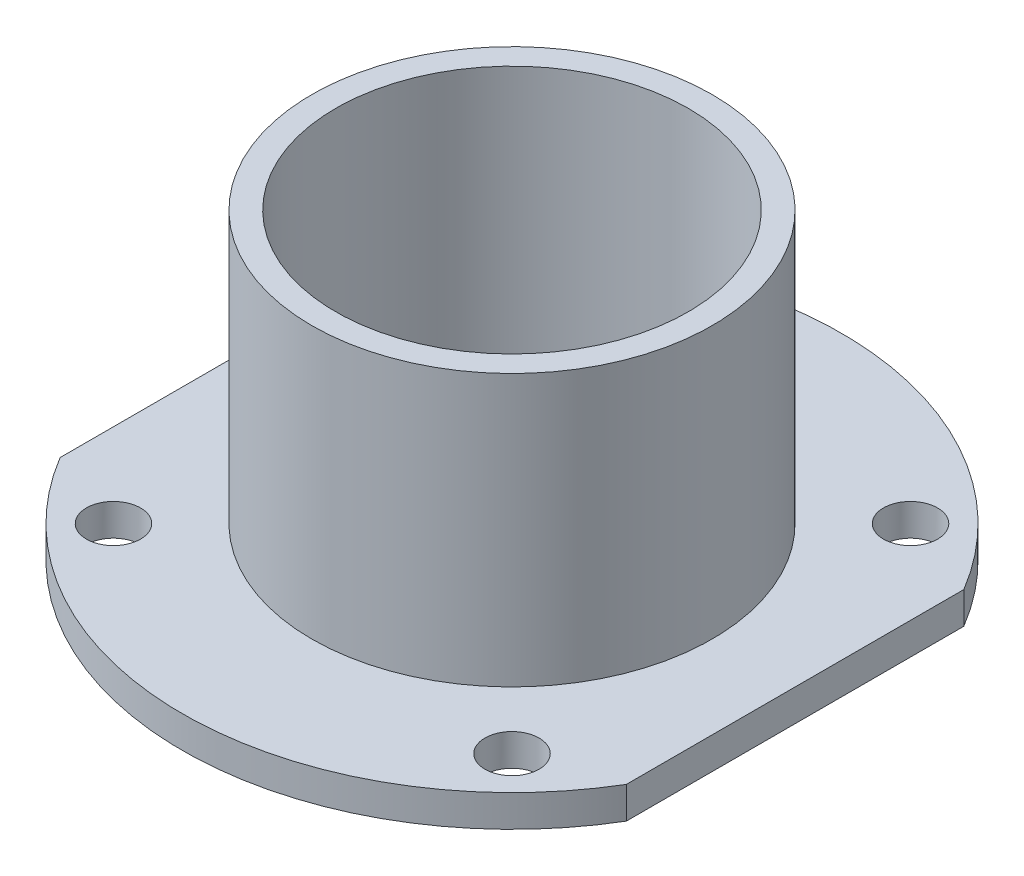
ISO-10303-21;
HEADER;
FILE_DESCRIPTION(('STEP AP214'),'2;1');
FILE_NAME('part.step','',(''),(''),'','','');
FILE_SCHEMA(('AUTOMOTIVE_DESIGN { 1 0 10303 214 1 1 1 1 }'));
ENDSEC;
DATA;
#1=APPLICATION_CONTEXT('core data for automotive mechanical design processes');
#2=APPLICATION_PROTOCOL_DEFINITION('international standard','automotive_design',2000,#1);
#3=PRODUCT_CONTEXT('',#1,'mechanical');
#4=PRODUCT('Part','Part','',(#3));
#5=PRODUCT_RELATED_PRODUCT_CATEGORY('part','',(#4));
#6=PRODUCT_DEFINITION_FORMATION('','',#4);
#7=PRODUCT_DEFINITION_CONTEXT('part definition',#1,'design');
#8=PRODUCT_DEFINITION('design','',#6,#7);
#9=PRODUCT_DEFINITION_SHAPE('','',#8);
#10=(LENGTH_UNIT() NAMED_UNIT(*) SI_UNIT(.MILLI.,.METRE.));
#11=(NAMED_UNIT(*) PLANE_ANGLE_UNIT() SI_UNIT($,.RADIAN.));
#12=(NAMED_UNIT(*) SI_UNIT($,.STERADIAN.) SOLID_ANGLE_UNIT());
#13=UNCERTAINTY_MEASURE_WITH_UNIT(LENGTH_MEASURE(1.E-05),#10,'distance_accuracy_value','');
#14=(GEOMETRIC_REPRESENTATION_CONTEXT(3) GLOBAL_UNCERTAINTY_ASSIGNED_CONTEXT((#13)) GLOBAL_UNIT_ASSIGNED_CONTEXT((#10,
#11,#12)) REPRESENTATION_CONTEXT('',''));
#15=CARTESIAN_POINT('',(0.,0.,0.));
#16=DIRECTION('',(0.,0.,1.));
#17=DIRECTION('',(1.,0.,0.));
#18=AXIS2_PLACEMENT_3D('',#15,#16,#17);
#19=CARTESIAN_POINT('',(0.,0.,0.));
#20=DIRECTION('',(0.,-1.,0.));
#21=DIRECTION('',(0.,0.,-1.));
#22=AXIS2_PLACEMENT_3D('',#19,#20,#21);
#23=CYLINDRICAL_SURFACE('',#22,20.7);
#24=DIRECTION('',(0.,-1.,0.));
#25=VECTOR('',#24,1.);
#26=CARTESIAN_POINT('',(17.78,0.,-10.6000754714294));
#27=LINE('',#26,#25);
#28=CARTESIAN_POINT('',(17.78,0.,-10.6000754714294));
#29=VERTEX_POINT('',#28);
#30=CARTESIAN_POINT('',(17.78,2.00000000000001,-10.6000754714294));
#31=VERTEX_POINT('',#30);
#32=EDGE_CURVE('E11',#29,#31,#27,.F.);
#33=ORIENTED_EDGE('',*,*,#32,.F.);
#34=CARTESIAN_POINT('',(0.,0.,0.));
#35=DIRECTION('',(0.,-1.,0.));
#36=DIRECTION('',(0.,0.,-1.));
#37=AXIS2_PLACEMENT_3D('',#34,#35,#36);
#38=CIRCLE('',#37,20.7);
#39=CARTESIAN_POINT('',(-17.78,0.,-10.6000754714294));
#40=VERTEX_POINT('',#39);
#41=EDGE_CURVE('E85',#40,#29,#38,.T.);
#42=ORIENTED_EDGE('',*,*,#41,.F.);
#43=DIRECTION('',(0.,-1.,0.));
#44=VECTOR('',#43,1.);
#45=CARTESIAN_POINT('',(-17.78,0.,-10.6000754714294));
#46=LINE('',#45,#44);
#47=CARTESIAN_POINT('',(-17.78,2.,-10.6000754714294));
#48=VERTEX_POINT('',#47);
#49=EDGE_CURVE('E111',#48,#40,#46,.T.);
#50=ORIENTED_EDGE('',*,*,#49,.F.);
#51=CARTESIAN_POINT('',(0.,2.,0.));
#52=DIRECTION('',(0.,-1.,0.));
#53=DIRECTION('',(0.,0.,-1.));
#54=AXIS2_PLACEMENT_3D('',#51,#52,#53);
#55=CIRCLE('',#54,20.7);
#56=EDGE_CURVE('E96',#48,#31,#55,.T.);
#57=ORIENTED_EDGE('',*,*,#56,.T.);
#58=EDGE_LOOP('',(#33,#42,#50,#57));
#59=FACE_BOUND('',#58,.T.);
#60=ADVANCED_FACE('F32',(#59),#23,.T.);
#61=CARTESIAN_POINT('',(20.7,0.,0.));
#62=DIRECTION('',(0.,-1.,0.));
#63=DIRECTION('',(0.,0.,-1.));
#64=AXIS2_PLACEMENT_3D('',#61,#62,#63);
#65=PLANE('',#64);
#66=CARTESIAN_POINT('',(12.5157900270019,0.,12.5157900270019));
#67=DIRECTION('',(0.,-1.,0.));
#68=DIRECTION('',(0.,0.,-1.));
#69=AXIS2_PLACEMENT_3D('',#66,#67,#68);
#70=CIRCLE('',#69,1.69999999999999);
#71=CARTESIAN_POINT('',(12.5157900270019,0.,10.8157900270019));
#72=VERTEX_POINT('',#71);
#73=EDGE_CURVE('E138',#72,#72,#70,.T.);
#74=ORIENTED_EDGE('',*,*,#73,.F.);
#75=EDGE_LOOP('',(#74));
#76=FACE_BOUND('',#75,.T.);
#77=CARTESIAN_POINT('',(-12.5157900270019,0.,12.5157900270019));
#78=DIRECTION('',(0.,-1.,0.));
#79=DIRECTION('',(0.,0.,-1.));
#80=AXIS2_PLACEMENT_3D('',#77,#78,#79);
#81=CIRCLE('',#80,1.69999999999999);
#82=CARTESIAN_POINT('',(-12.5157900270019,0.,10.8157900270019));
#83=VERTEX_POINT('',#82);
#84=EDGE_CURVE('E132',#83,#83,#81,.T.);
#85=ORIENTED_EDGE('',*,*,#84,.F.);
#86=EDGE_LOOP('',(#85));
#87=FACE_BOUND('',#86,.T.);
#88=CARTESIAN_POINT('',(-12.5157900270019,0.,-12.5157900270019));
#89=DIRECTION('',(0.,-1.,0.));
#90=DIRECTION('',(0.,0.,-1.));
#91=AXIS2_PLACEMENT_3D('',#88,#89,#90);
#92=CIRCLE('',#91,1.69999999999999);
#93=CARTESIAN_POINT('',(-12.5157900270019,0.,-14.2157900270019));
#94=VERTEX_POINT('',#93);
#95=EDGE_CURVE('E126',#94,#94,#92,.T.);
#96=ORIENTED_EDGE('',*,*,#95,.F.);
#97=EDGE_LOOP('',(#96));
#98=FACE_BOUND('',#97,.T.);
#99=CARTESIAN_POINT('',(12.5157900270019,0.,-12.5157900270019));
#100=DIRECTION('',(0.,-1.,0.));
#101=DIRECTION('',(0.,0.,-1.));
#102=AXIS2_PLACEMENT_3D('',#99,#100,#101);
#103=CIRCLE('',#102,1.69999999999999);
#104=CARTESIAN_POINT('',(12.5157900270019,0.,-14.2157900270019));
#105=VERTEX_POINT('',#104);
#106=EDGE_CURVE('E86',#105,#105,#103,.T.);
#107=ORIENTED_EDGE('',*,*,#106,.F.);
#108=EDGE_LOOP('',(#107));
#109=FACE_BOUND('',#108,.T.);
#110=DIRECTION('',(0.,0.,-1.));
#111=VECTOR('',#110,1.);
#112=CARTESIAN_POINT('',(17.78,0.,-10.6000754714294));
#113=LINE('',#112,#111);
#114=CARTESIAN_POINT('',(17.78,0.,10.6000754714294));
#115=VERTEX_POINT('',#114);
#116=EDGE_CURVE('E72',#115,#29,#113,.T.);
#117=ORIENTED_EDGE('',*,*,#116,.F.);
#118=CARTESIAN_POINT('',(-17.78,0.,10.6000754714294));
#119=VERTEX_POINT('',#118);
#120=EDGE_CURVE('E82',#115,#119,#38,.T.);
#121=ORIENTED_EDGE('',*,*,#120,.T.);
#122=DIRECTION('',(0.,0.,1.));
#123=VECTOR('',#122,1.);
#124=CARTESIAN_POINT('',(-17.78,0.,10.6000754714294));
#125=LINE('',#124,#123);
#126=EDGE_CURVE('E92',#40,#119,#125,.T.);
#127=ORIENTED_EDGE('',*,*,#126,.F.);
#128=ORIENTED_EDGE('',*,*,#41,.T.);
#129=EDGE_LOOP('',(#117,#121,#127,#128));
#130=FACE_BOUND('',#129,.T.);
#131=CARTESIAN_POINT('',(0.,0.,0.));
#132=DIRECTION('',(0.,-1.,0.));
#133=DIRECTION('',(0.,0.,-1.));
#134=AXIS2_PLACEMENT_3D('',#131,#132,#133);
#135=CIRCLE('',#134,11.073);
#136=CARTESIAN_POINT('',(0.,0.,-11.073));
#137=VERTEX_POINT('',#136);
#138=EDGE_CURVE('E108',#137,#137,#135,.T.);
#139=ORIENTED_EDGE('',*,*,#138,.F.);
#140=EDGE_LOOP('',(#139));
#141=FACE_BOUND('',#140,.T.);
#142=ADVANCED_FACE('F34',(#76,#87,#98,#109,#130,#141),#65,.T.);
#143=CARTESIAN_POINT('',(0.,0.,0.));
#144=DIRECTION('',(0.,-1.,0.));
#145=DIRECTION('',(0.,0.,-1.));
#146=AXIS2_PLACEMENT_3D('',#143,#144,#145);
#147=CYLINDRICAL_SURFACE('',#146,11.073);
#148=ORIENTED_EDGE('',*,*,#138,.T.);
#149=EDGE_LOOP('',(#148));
#150=FACE_BOUND('',#149,.T.);
#151=CARTESIAN_POINT('',(0.,19.05,0.));
#152=DIRECTION('',(0.,-1.,0.));
#153=DIRECTION('',(0.,0.,-1.));
#154=AXIS2_PLACEMENT_3D('',#151,#152,#153);
#155=CIRCLE('',#154,11.073);
#156=CARTESIAN_POINT('',(0.,19.05,-11.073));
#157=VERTEX_POINT('',#156);
#158=EDGE_CURVE('E105',#157,#157,#155,.T.);
#159=ORIENTED_EDGE('',*,*,#158,.F.);
#160=EDGE_LOOP('',(#159));
#161=FACE_BOUND('',#160,.T.);
#162=ADVANCED_FACE('F175',(#150,#161),#147,.F.);
#163=CARTESIAN_POINT('',(11.073,19.05,0.));
#164=DIRECTION('',(0.,1.,0.));
#165=DIRECTION('',(0.,0.,1.));
#166=AXIS2_PLACEMENT_3D('',#163,#164,#165);
#167=PLANE('',#166);
#168=ORIENTED_EDGE('',*,*,#158,.T.);
#169=EDGE_LOOP('',(#168));
#170=FACE_BOUND('',#169,.T.);
#171=CARTESIAN_POINT('',(0.,19.05,0.));
#172=DIRECTION('',(0.,-1.,0.));
#173=DIRECTION('',(0.,0.,-1.));
#174=AXIS2_PLACEMENT_3D('',#171,#172,#173);
#175=CIRCLE('',#174,12.573);
#176=CARTESIAN_POINT('',(0.,19.05,-12.573));
#177=VERTEX_POINT('',#176);
#178=EDGE_CURVE('E102',#177,#177,#175,.T.);
#179=ORIENTED_EDGE('',*,*,#178,.F.);
#180=EDGE_LOOP('',(#179));
#181=FACE_BOUND('',#180,.T.);
#182=ADVANCED_FACE('F249',(#170,#181),#167,.T.);
#183=CARTESIAN_POINT('',(0.,0.,0.));
#184=DIRECTION('',(0.,-1.,0.));
#185=DIRECTION('',(0.,0.,-1.));
#186=AXIS2_PLACEMENT_3D('',#183,#184,#185);
#187=CYLINDRICAL_SURFACE('',#186,12.573);
#188=ORIENTED_EDGE('',*,*,#178,.T.);
#189=EDGE_LOOP('',(#188));
#190=FACE_BOUND('',#189,.T.);
#191=CARTESIAN_POINT('',(0.,2.,0.));
#192=DIRECTION('',(0.,-1.,0.));
#193=DIRECTION('',(0.,0.,-1.));
#194=AXIS2_PLACEMENT_3D('',#191,#192,#193);
#195=CIRCLE('',#194,12.573);
#196=CARTESIAN_POINT('',(0.,2.,-12.573));
#197=VERTEX_POINT('',#196);
#198=EDGE_CURVE('E99',#197,#197,#195,.T.);
#199=ORIENTED_EDGE('',*,*,#198,.F.);
#200=EDGE_LOOP('',(#199));
#201=FACE_BOUND('',#200,.T.);
#202=ADVANCED_FACE('F149',(#190,#201),#187,.T.);
#203=CARTESIAN_POINT('',(12.573,2.,0.));
#204=DIRECTION('',(0.,1.,0.));
#205=DIRECTION('',(0.,0.,1.));
#206=AXIS2_PLACEMENT_3D('',#203,#204,#205);
#207=PLANE('',#206);
#208=CARTESIAN_POINT('',(12.5157900270019,2.,12.5157900270019));
#209=DIRECTION('',(0.,1.,0.));
#210=DIRECTION('',(0.,0.,1.));
#211=AXIS2_PLACEMENT_3D('',#208,#209,#210);
#212=CIRCLE('',#211,1.69999999999999);
#213=CARTESIAN_POINT('',(12.5157900270019,2.,14.2157900270019));
#214=VERTEX_POINT('',#213);
#215=EDGE_CURVE('E141',#214,#214,#212,.T.);
#216=ORIENTED_EDGE('',*,*,#215,.F.);
#217=EDGE_LOOP('',(#216));
#218=FACE_BOUND('',#217,.T.);
#219=CARTESIAN_POINT('',(-12.5157900270019,2.,12.5157900270019));
#220=DIRECTION('',(0.,1.,0.));
#221=DIRECTION('',(0.,0.,1.));
#222=AXIS2_PLACEMENT_3D('',#219,#220,#221);
#223=CIRCLE('',#222,1.69999999999999);
#224=CARTESIAN_POINT('',(-12.5157900270019,2.,14.2157900270019));
#225=VERTEX_POINT('',#224);
#226=EDGE_CURVE('E135',#225,#225,#223,.T.);
#227=ORIENTED_EDGE('',*,*,#226,.F.);
#228=EDGE_LOOP('',(#227));
#229=FACE_BOUND('',#228,.T.);
#230=CARTESIAN_POINT('',(-12.5157900270019,2.,-12.5157900270019));
#231=DIRECTION('',(0.,1.,0.));
#232=DIRECTION('',(0.,0.,1.));
#233=AXIS2_PLACEMENT_3D('',#230,#231,#232);
#234=CIRCLE('',#233,1.69999999999999);
#235=CARTESIAN_POINT('',(-12.5157900270019,2.,-10.8157900270019));
#236=VERTEX_POINT('',#235);
#237=EDGE_CURVE('E129',#236,#236,#234,.T.);
#238=ORIENTED_EDGE('',*,*,#237,.F.);
#239=EDGE_LOOP('',(#238));
#240=FACE_BOUND('',#239,.T.);
#241=CARTESIAN_POINT('',(12.5157900270019,2.,-12.5157900270019));
#242=DIRECTION('',(0.,1.,0.));
#243=DIRECTION('',(0.,0.,1.));
#244=AXIS2_PLACEMENT_3D('',#241,#242,#243);
#245=CIRCLE('',#244,1.69999999999999);
#246=CARTESIAN_POINT('',(12.5157900270019,2.,-10.8157900270019));
#247=VERTEX_POINT('',#246);
#248=EDGE_CURVE('E123',#247,#247,#245,.T.);
#249=ORIENTED_EDGE('',*,*,#248,.F.);
#250=EDGE_LOOP('',(#249));
#251=FACE_BOUND('',#250,.T.);
#252=DIRECTION('',(0.,0.,1.));
#253=VECTOR('',#252,1.);
#254=CARTESIAN_POINT('',(17.78,2.,0.));
#255=LINE('',#254,#253);
#256=CARTESIAN_POINT('',(17.78,2.,10.6000754714294));
#257=VERTEX_POINT('',#256);
#258=EDGE_CURVE('E46',#31,#257,#255,.T.);
#259=ORIENTED_EDGE('',*,*,#258,.F.);
#260=ORIENTED_EDGE('',*,*,#56,.F.);
#261=DIRECTION('',(0.,0.,-1.));
#262=VECTOR('',#261,1.);
#263=CARTESIAN_POINT('',(-17.78,2.,0.));
#264=LINE('',#263,#262);
#265=CARTESIAN_POINT('',(-17.78,2.00000000000001,10.6000754714294));
#266=VERTEX_POINT('',#265);
#267=EDGE_CURVE('E54',#266,#48,#264,.T.);
#268=ORIENTED_EDGE('',*,*,#267,.F.);
#269=EDGE_CURVE('E91',#257,#266,#55,.T.);
#270=ORIENTED_EDGE('',*,*,#269,.F.);
#271=EDGE_LOOP('',(#259,#260,#268,#270));
#272=FACE_BOUND('',#271,.T.);
#273=ORIENTED_EDGE('',*,*,#198,.T.);
#274=EDGE_LOOP('',(#273));
#275=FACE_BOUND('',#274,.T.);
#276=ADVANCED_FACE('F116',(#218,#229,#240,#251,#272,#275),#207,.T.);
#277=DIRECTION('',(0.,-1.,0.));
#278=VECTOR('',#277,1.);
#279=CARTESIAN_POINT('',(17.78,0.,10.6000754714294));
#280=LINE('',#279,#278);
#281=EDGE_CURVE('E40',#257,#115,#280,.T.);
#282=ORIENTED_EDGE('',*,*,#281,.F.);
#283=ORIENTED_EDGE('',*,*,#269,.T.);
#284=DIRECTION('',(0.,-1.,0.));
#285=VECTOR('',#284,1.);
#286=CARTESIAN_POINT('',(-17.78,0.,10.6000754714294));
#287=LINE('',#286,#285);
#288=EDGE_CURVE('E77',#119,#266,#287,.F.);
#289=ORIENTED_EDGE('',*,*,#288,.F.);
#290=ORIENTED_EDGE('',*,*,#120,.F.);
#291=EDGE_LOOP('',(#282,#283,#289,#290));
#292=FACE_BOUND('',#291,.T.);
#293=ADVANCED_FACE('F89',(#292),#23,.T.);
#294=CARTESIAN_POINT('',(-17.78,19.05,10.6000754714294));
#295=DIRECTION('',(1.,0.,0.));
#296=DIRECTION('',(0.,0.,-1.));
#297=AXIS2_PLACEMENT_3D('',#294,#295,#296);
#298=PLANE('',#297);
#299=ORIENTED_EDGE('',*,*,#267,.T.);
#300=ORIENTED_EDGE('',*,*,#49,.T.);
#301=ORIENTED_EDGE('',*,*,#126,.T.);
#302=ORIENTED_EDGE('',*,*,#288,.T.);
#303=EDGE_LOOP('',(#299,#300,#301,#302));
#304=FACE_BOUND('',#303,.T.);
#305=ADVANCED_FACE('F113',(#304),#298,.F.);
#306=CARTESIAN_POINT('',(17.78,19.05,-10.6000754714294));
#307=DIRECTION('',(-1.,0.,0.));
#308=DIRECTION('',(0.,0.,1.));
#309=AXIS2_PLACEMENT_3D('',#306,#307,#308);
#310=PLANE('',#309);
#311=ORIENTED_EDGE('',*,*,#258,.T.);
#312=ORIENTED_EDGE('',*,*,#281,.T.);
#313=ORIENTED_EDGE('',*,*,#116,.T.);
#314=ORIENTED_EDGE('',*,*,#32,.T.);
#315=EDGE_LOOP('',(#311,#312,#313,#314));
#316=FACE_BOUND('',#315,.T.);
#317=ADVANCED_FACE('F71',(#316),#310,.F.);
#318=CARTESIAN_POINT('',(12.5157900270019,2.,-12.5157900270019));
#319=DIRECTION('',(0.,1.,0.));
#320=DIRECTION('',(0.,0.,1.));
#321=AXIS2_PLACEMENT_3D('',#318,#319,#320);
#322=CYLINDRICAL_SURFACE('',#321,1.69999999999999);
#323=ORIENTED_EDGE('',*,*,#106,.T.);
#324=EDGE_LOOP('',(#323));
#325=FACE_BOUND('',#324,.T.);
#326=ORIENTED_EDGE('',*,*,#248,.T.);
#327=EDGE_LOOP('',(#326));
#328=FACE_BOUND('',#327,.T.);
#329=ADVANCED_FACE('F157',(#325,#328),#322,.F.);
#330=CARTESIAN_POINT('',(-12.5157900270019,2.,-12.5157900270019));
#331=DIRECTION('',(0.,1.,0.));
#332=DIRECTION('',(0.,0.,1.));
#333=AXIS2_PLACEMENT_3D('',#330,#331,#332);
#334=CYLINDRICAL_SURFACE('',#333,1.69999999999999);
#335=ORIENTED_EDGE('',*,*,#95,.T.);
#336=EDGE_LOOP('',(#335));
#337=FACE_BOUND('',#336,.T.);
#338=ORIENTED_EDGE('',*,*,#237,.T.);
#339=EDGE_LOOP('',(#338));
#340=FACE_BOUND('',#339,.T.);
#341=ADVANCED_FACE('F159',(#337,#340),#334,.F.);
#342=CARTESIAN_POINT('',(-12.5157900270019,2.,12.5157900270019));
#343=DIRECTION('',(0.,1.,0.));
#344=DIRECTION('',(0.,0.,1.));
#345=AXIS2_PLACEMENT_3D('',#342,#343,#344);
#346=CYLINDRICAL_SURFACE('',#345,1.69999999999999);
#347=ORIENTED_EDGE('',*,*,#84,.T.);
#348=EDGE_LOOP('',(#347));
#349=FACE_BOUND('',#348,.T.);
#350=ORIENTED_EDGE('',*,*,#226,.T.);
#351=EDGE_LOOP('',(#350));
#352=FACE_BOUND('',#351,.T.);
#353=ADVANCED_FACE('F166',(#349,#352),#346,.F.);
#354=CARTESIAN_POINT('',(12.5157900270019,2.,12.5157900270019));
#355=DIRECTION('',(0.,1.,0.));
#356=DIRECTION('',(0.,0.,1.));
#357=AXIS2_PLACEMENT_3D('',#354,#355,#356);
#358=CYLINDRICAL_SURFACE('',#357,1.69999999999999);
#359=ORIENTED_EDGE('',*,*,#73,.T.);
#360=EDGE_LOOP('',(#359));
#361=FACE_BOUND('',#360,.T.);
#362=ORIENTED_EDGE('',*,*,#215,.T.);
#363=EDGE_LOOP('',(#362));
#364=FACE_BOUND('',#363,.T.);
#365=ADVANCED_FACE('F145',(#361,#364),#358,.F.);
#366=CLOSED_SHELL('',(#60,#142,#162,#182,#202,#276,#293,#305,#317,#329,#341,#353,#365));
#367=MANIFOLD_SOLID_BREP('B2',#366);
#368=ADVANCED_BREP_SHAPE_REPRESENTATION('',(#18,#367),#14);
#369=SHAPE_DEFINITION_REPRESENTATION(#9,#368);
ENDSEC;
END-ISO-10303-21;
